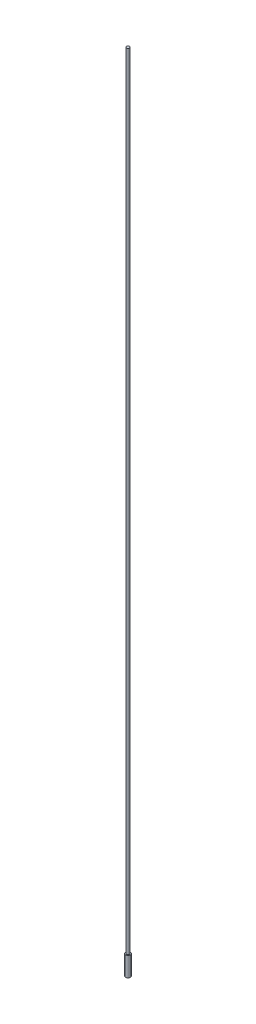
ISO-10303-21;
HEADER;
FILE_DESCRIPTION(('STEP AP214'),'2;1');
FILE_NAME('part.step','',(''),(''),'','','');
FILE_SCHEMA(('AUTOMOTIVE_DESIGN { 1 0 10303 214 1 1 1 1 }'));
ENDSEC;
DATA;
#1=APPLICATION_CONTEXT('core data for automotive mechanical design processes');
#2=APPLICATION_PROTOCOL_DEFINITION('international standard','automotive_design',2000,#1);
#3=PRODUCT_CONTEXT('',#1,'mechanical');
#4=PRODUCT('Part','Part','',(#3));
#5=PRODUCT_RELATED_PRODUCT_CATEGORY('part','',(#4));
#6=PRODUCT_DEFINITION_FORMATION('','',#4);
#7=PRODUCT_DEFINITION_CONTEXT('part definition',#1,'design');
#8=PRODUCT_DEFINITION('design','',#6,#7);
#9=PRODUCT_DEFINITION_SHAPE('','',#8);
#10=(LENGTH_UNIT() NAMED_UNIT(*) SI_UNIT(.MILLI.,.METRE.));
#11=(NAMED_UNIT(*) PLANE_ANGLE_UNIT() SI_UNIT($,.RADIAN.));
#12=(NAMED_UNIT(*) SI_UNIT($,.STERADIAN.) SOLID_ANGLE_UNIT());
#13=UNCERTAINTY_MEASURE_WITH_UNIT(LENGTH_MEASURE(1.E-05),#10,'distance_accuracy_value','');
#14=(GEOMETRIC_REPRESENTATION_CONTEXT(3) GLOBAL_UNCERTAINTY_ASSIGNED_CONTEXT((#13)) GLOBAL_UNIT_ASSIGNED_CONTEXT((#10,
#11,#12)) REPRESENTATION_CONTEXT('',''));
#15=CARTESIAN_POINT('',(0.,0.,0.));
#16=DIRECTION('',(0.,0.,1.));
#17=DIRECTION('',(1.,0.,0.));
#18=AXIS2_PLACEMENT_3D('',#15,#16,#17);
#19=CARTESIAN_POINT('',(0.,701.675,0.));
#20=DIRECTION('',(0.,-1.,0.));
#21=DIRECTION('',(0.,0.,-1.));
#22=AXIS2_PLACEMENT_3D('',#19,#20,#21);
#23=CYLINDRICAL_SURFACE('',#22,1.25);
#24=CARTESIAN_POINT('',(0.,701.675,0.));
#25=DIRECTION('',(0.,1.,0.));
#26=DIRECTION('',(0.,0.,1.));
#27=AXIS2_PLACEMENT_3D('',#24,#25,#26);
#28=CIRCLE('',#27,1.25);
#29=CARTESIAN_POINT('',(0.,701.675,1.25));
#30=VERTEX_POINT('',#29);
#31=EDGE_CURVE('E50',#30,#30,#28,.T.);
#32=ORIENTED_EDGE('',*,*,#31,.F.);
#33=EDGE_LOOP('',(#32));
#34=FACE_BOUND('',#33,.T.);
#35=CARTESIAN_POINT('',(0.,17.,0.));
#36=DIRECTION('',(0.,-1.,0.));
#37=DIRECTION('',(0.,0.,-1.));
#38=AXIS2_PLACEMENT_3D('',#35,#36,#37);
#39=CIRCLE('',#38,1.25);
#40=CARTESIAN_POINT('',(0.,17.,-1.25));
#41=VERTEX_POINT('',#40);
#42=EDGE_CURVE('E10',#41,#41,#39,.T.);
#43=ORIENTED_EDGE('',*,*,#42,.F.);
#44=EDGE_LOOP('',(#43));
#45=FACE_BOUND('',#44,.T.);
#46=ADVANCED_FACE('F43',(#34,#45),#23,.T.);
#47=CARTESIAN_POINT('',(0.,701.675,0.));
#48=DIRECTION('',(0.,1.,0.));
#49=DIRECTION('',(0.,0.,1.));
#50=AXIS2_PLACEMENT_3D('',#47,#48,#49);
#51=PLANE('',#50);
#52=ORIENTED_EDGE('',*,*,#31,.T.);
#53=EDGE_LOOP('',(#52));
#54=FACE_BOUND('',#53,.T.);
#55=ADVANCED_FACE('F72',(#54),#51,.T.);
#56=CARTESIAN_POINT('',(0.,17.,0.));
#57=DIRECTION('',(0.,-1.,0.));
#58=DIRECTION('',(0.,0.,-1.));
#59=AXIS2_PLACEMENT_3D('',#56,#57,#58);
#60=CYLINDRICAL_SURFACE('',#59,2.1);
#61=CARTESIAN_POINT('',(0.,17.,0.));
#62=DIRECTION('',(0.,-1.,0.));
#63=DIRECTION('',(0.,0.,-1.));
#64=AXIS2_PLACEMENT_3D('',#61,#62,#63);
#65=CIRCLE('',#64,2.1);
#66=CARTESIAN_POINT('',(0.,17.,-2.1));
#67=VERTEX_POINT('',#66);
#68=EDGE_CURVE('E55',#67,#67,#65,.T.);
#69=ORIENTED_EDGE('',*,*,#68,.T.);
#70=EDGE_LOOP('',(#69));
#71=FACE_BOUND('',#70,.T.);
#72=CARTESIAN_POINT('',(0.,0.,0.));
#73=DIRECTION('',(0.,-1.,0.));
#74=DIRECTION('',(0.,0.,-1.));
#75=AXIS2_PLACEMENT_3D('',#72,#73,#74);
#76=CIRCLE('',#75,2.1);
#77=CARTESIAN_POINT('',(0.,0.,-2.1));
#78=VERTEX_POINT('',#77);
#79=EDGE_CURVE('E60',#78,#78,#76,.T.);
#80=ORIENTED_EDGE('',*,*,#79,.F.);
#81=EDGE_LOOP('',(#80));
#82=FACE_BOUND('',#81,.T.);
#83=ADVANCED_FACE('F69',(#71,#82),#60,.T.);
#84=CARTESIAN_POINT('',(0.,17.,0.));
#85=DIRECTION('',(0.,-1.,0.));
#86=DIRECTION('',(0.,0.,-1.));
#87=AXIS2_PLACEMENT_3D('',#84,#85,#86);
#88=PLANE('',#87);
#89=ORIENTED_EDGE('',*,*,#42,.T.);
#90=EDGE_LOOP('',(#89));
#91=FACE_BOUND('',#90,.T.);
#92=ORIENTED_EDGE('',*,*,#68,.F.);
#93=EDGE_LOOP('',(#92));
#94=FACE_BOUND('',#93,.T.);
#95=ADVANCED_FACE('F71',(#91,#94),#88,.F.);
#96=CARTESIAN_POINT('',(0.,0.,0.));
#97=DIRECTION('',(0.,1.,0.));
#98=DIRECTION('',(0.,0.,1.));
#99=AXIS2_PLACEMENT_3D('',#96,#97,#98);
#100=PLANE('',#99);
#101=ORIENTED_EDGE('',*,*,#79,.T.);
#102=EDGE_LOOP('',(#101));
#103=FACE_BOUND('',#102,.T.);
#104=ADVANCED_FACE('F67',(#103),#100,.F.);
#105=CLOSED_SHELL('',(#46,#55,#83,#95,#104));
#106=MANIFOLD_SOLID_BREP('B2',#105);
#107=ADVANCED_BREP_SHAPE_REPRESENTATION('',(#18,#106),#14);
#108=SHAPE_DEFINITION_REPRESENTATION(#9,#107);
ENDSEC;
END-ISO-10303-21;
